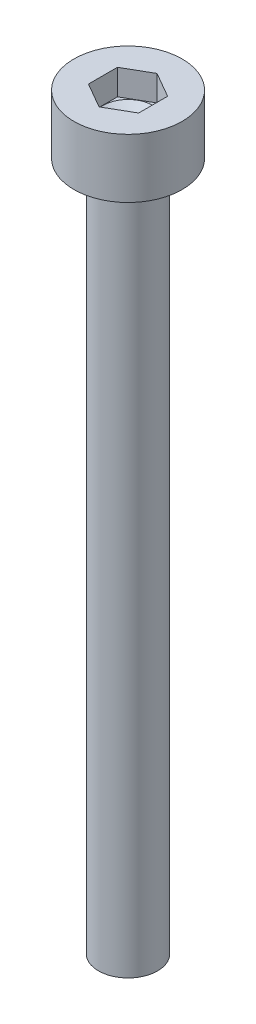
ISO-10303-21;
HEADER;
FILE_DESCRIPTION(('STEP AP214'),'2;1');
FILE_NAME('part.step','',(''),(''),'','','');
FILE_SCHEMA(('AUTOMOTIVE_DESIGN { 1 0 10303 214 1 1 1 1 }'));
ENDSEC;
DATA;
#1=APPLICATION_CONTEXT('core data for automotive mechanical design processes');
#2=APPLICATION_PROTOCOL_DEFINITION('international standard','automotive_design',2000,#1);
#3=PRODUCT_CONTEXT('',#1,'mechanical');
#4=PRODUCT('Part','Part','',(#3));
#5=PRODUCT_RELATED_PRODUCT_CATEGORY('part','',(#4));
#6=PRODUCT_DEFINITION_FORMATION('','',#4);
#7=PRODUCT_DEFINITION_CONTEXT('part definition',#1,'design');
#8=PRODUCT_DEFINITION('design','',#6,#7);
#9=PRODUCT_DEFINITION_SHAPE('','',#8);
#10=(LENGTH_UNIT() NAMED_UNIT(*) SI_UNIT(.MILLI.,.METRE.));
#11=(NAMED_UNIT(*) PLANE_ANGLE_UNIT() SI_UNIT($,.RADIAN.));
#12=(NAMED_UNIT(*) SI_UNIT($,.STERADIAN.) SOLID_ANGLE_UNIT());
#13=UNCERTAINTY_MEASURE_WITH_UNIT(LENGTH_MEASURE(1.E-05),#10,'distance_accuracy_value','');
#14=(GEOMETRIC_REPRESENTATION_CONTEXT(3) GLOBAL_UNCERTAINTY_ASSIGNED_CONTEXT((#13)) GLOBAL_UNIT_ASSIGNED_CONTEXT((#10,
#11,#12)) REPRESENTATION_CONTEXT('',''));
#15=CARTESIAN_POINT('',(0.,0.,0.));
#16=DIRECTION('',(0.,0.,1.));
#17=DIRECTION('',(1.,0.,0.));
#18=AXIS2_PLACEMENT_3D('',#15,#16,#17);
#19=CARTESIAN_POINT('',(0.,0.,0.));
#20=DIRECTION('',(0.,-1.,0.));
#21=DIRECTION('',(0.,0.,-1.));
#22=AXIS2_PLACEMENT_3D('',#19,#20,#21);
#23=PLANE('',#22);
#24=CARTESIAN_POINT('',(0.,0.,0.));
#25=DIRECTION('',(0.,-1.,0.));
#26=DIRECTION('',(0.,0.,-1.));
#27=AXIS2_PLACEMENT_3D('',#24,#25,#26);
#28=CIRCLE('',#27,2.75);
#29=CARTESIAN_POINT('',(0.,0.,-2.75));
#30=VERTEX_POINT('',#29);
#31=EDGE_CURVE('E11',#30,#30,#28,.T.);
#32=ORIENTED_EDGE('',*,*,#31,.T.);
#33=EDGE_LOOP('',(#32));
#34=FACE_BOUND('',#33,.T.);
#35=CARTESIAN_POINT('',(0.,0.,0.));
#36=DIRECTION('',(0.,-1.,0.));
#37=DIRECTION('',(0.,0.,-1.));
#38=AXIS2_PLACEMENT_3D('',#35,#36,#37);
#39=CIRCLE('',#38,1.5);
#40=CARTESIAN_POINT('',(0.,0.,-1.5));
#41=VERTEX_POINT('',#40);
#42=EDGE_CURVE('E143',#41,#41,#39,.T.);
#43=ORIENTED_EDGE('',*,*,#42,.F.);
#44=EDGE_LOOP('',(#43));
#45=FACE_BOUND('',#44,.T.);
#46=ADVANCED_FACE('F17',(#34,#45),#23,.T.);
#47=CARTESIAN_POINT('',(0.,0.,0.));
#48=DIRECTION('',(0.,-1.,0.));
#49=DIRECTION('',(0.,0.,-1.));
#50=AXIS2_PLACEMENT_3D('',#47,#48,#49);
#51=CYLINDRICAL_SURFACE('',#50,2.75);
#52=CARTESIAN_POINT('',(0.,3.,0.));
#53=DIRECTION('',(0.,-1.,0.));
#54=DIRECTION('',(0.,0.,-1.));
#55=AXIS2_PLACEMENT_3D('',#52,#53,#54);
#56=CIRCLE('',#55,2.75);
#57=CARTESIAN_POINT('',(0.,3.,-2.75));
#58=VERTEX_POINT('',#57);
#59=EDGE_CURVE('E24',#58,#58,#56,.T.);
#60=ORIENTED_EDGE('',*,*,#59,.T.);
#61=EDGE_LOOP('',(#60));
#62=FACE_BOUND('',#61,.T.);
#63=ORIENTED_EDGE('',*,*,#31,.F.);
#64=EDGE_LOOP('',(#63));
#65=FACE_BOUND('',#64,.T.);
#66=ADVANCED_FACE('F120',(#62,#65),#51,.T.);
#67=CARTESIAN_POINT('',(2.75,3.,0.));
#68=DIRECTION('',(0.,1.,0.));
#69=DIRECTION('',(0.,0.,1.));
#70=AXIS2_PLACEMENT_3D('',#67,#68,#69);
#71=PLANE('',#70);
#72=DIRECTION('',(-0.866025403784439,0.,-0.5));
#73=VECTOR('',#72,1.);
#74=CARTESIAN_POINT('',(1.275,3.,-0.736121593216773));
#75=LINE('',#74,#73);
#76=CARTESIAN_POINT('',(1.275,3.,-0.736121593216773));
#77=VERTEX_POINT('',#76);
#78=CARTESIAN_POINT('',(0.,3.,-1.47224318643355));
#79=VERTEX_POINT('',#78);
#80=EDGE_CURVE('E31',#77,#79,#75,.T.);
#81=ORIENTED_EDGE('',*,*,#80,.F.);
#82=DIRECTION('',(0.,0.,-1.));
#83=VECTOR('',#82,1.);
#84=CARTESIAN_POINT('',(1.275,3.,0.736121593216772));
#85=LINE('',#84,#83);
#86=CARTESIAN_POINT('',(1.275,3.,0.736121593216772));
#87=VERTEX_POINT('',#86);
#88=EDGE_CURVE('E101',#87,#77,#85,.T.);
#89=ORIENTED_EDGE('',*,*,#88,.F.);
#90=DIRECTION('',(0.866025403784439,0.,-0.5));
#91=VECTOR('',#90,1.);
#92=CARTESIAN_POINT('',(0.,3.,1.47224318643355));
#93=LINE('',#92,#91);
#94=CARTESIAN_POINT('',(0.,3.,1.47224318643355));
#95=VERTEX_POINT('',#94);
#96=EDGE_CURVE('E95',#95,#87,#93,.T.);
#97=ORIENTED_EDGE('',*,*,#96,.F.);
#98=DIRECTION('',(0.866025403784439,0.,0.5));
#99=VECTOR('',#98,1.);
#100=CARTESIAN_POINT('',(-1.275,3.,0.736121593216773));
#101=LINE('',#100,#99);
#102=CARTESIAN_POINT('',(-1.275,3.,0.736121593216773));
#103=VERTEX_POINT('',#102);
#104=EDGE_CURVE('E93',#103,#95,#101,.T.);
#105=ORIENTED_EDGE('',*,*,#104,.F.);
#106=DIRECTION('',(0.,0.,1.));
#107=VECTOR('',#106,1.);
#108=CARTESIAN_POINT('',(-1.275,3.,-0.736121593216773));
#109=LINE('',#108,#107);
#110=CARTESIAN_POINT('',(-1.275,3.,-0.736121593216773));
#111=VERTEX_POINT('',#110);
#112=EDGE_CURVE('E75',#111,#103,#109,.T.);
#113=ORIENTED_EDGE('',*,*,#112,.F.);
#114=DIRECTION('',(-0.866025403784439,0.,0.5));
#115=VECTOR('',#114,1.);
#116=CARTESIAN_POINT('',(0.,3.,-1.47224318643354));
#117=LINE('',#116,#115);
#118=EDGE_CURVE('E85',#79,#111,#117,.T.);
#119=ORIENTED_EDGE('',*,*,#118,.F.);
#120=EDGE_LOOP('',(#81,#89,#97,#105,#113,#119));
#121=FACE_BOUND('',#120,.T.);
#122=ORIENTED_EDGE('',*,*,#59,.F.);
#123=EDGE_LOOP('',(#122));
#124=FACE_BOUND('',#123,.T.);
#125=ADVANCED_FACE('F89',(#121,#124),#71,.T.);
#126=CARTESIAN_POINT('',(1.275,-2.19518934071246,-0.736121593216773));
#127=DIRECTION('',(0.5,0.,-0.866025403784439));
#128=DIRECTION('',(-0.866025403784439,0.,-0.5));
#129=AXIS2_PLACEMENT_3D('',#126,#127,#128);
#130=PLANE('',#129);
#131=DIRECTION('',(0.866025403784439,0.,0.5));
#132=VECTOR('',#131,1.);
#133=CARTESIAN_POINT('',(1.275,1.7,-0.736121593216773));
#134=LINE('',#133,#132);
#135=CARTESIAN_POINT('',(0.,1.7,-1.47224318643354));
#136=VERTEX_POINT('',#135);
#137=CARTESIAN_POINT('',(1.275,1.7,-0.736121593216773));
#138=VERTEX_POINT('',#137);
#139=EDGE_CURVE('E115',#136,#138,#134,.T.);
#140=ORIENTED_EDGE('',*,*,#139,.T.);
#141=DIRECTION('',(0.,1.,0.));
#142=VECTOR('',#141,1.);
#143=CARTESIAN_POINT('',(1.275,-2.19518934071246,-0.736121593216773));
#144=LINE('',#143,#142);
#145=EDGE_CURVE('E104',#138,#77,#144,.T.);
#146=ORIENTED_EDGE('',*,*,#145,.T.);
#147=ORIENTED_EDGE('',*,*,#80,.T.);
#148=DIRECTION('',(0.,1.,0.));
#149=VECTOR('',#148,1.);
#150=CARTESIAN_POINT('',(0.,-2.19518934071246,-1.47224318643354));
#151=LINE('',#150,#149);
#152=EDGE_CURVE('E82',#136,#79,#151,.T.);
#153=ORIENTED_EDGE('',*,*,#152,.F.);
#154=EDGE_LOOP('',(#140,#146,#147,#153));
#155=FACE_BOUND('',#154,.T.);
#156=ADVANCED_FACE('F123',(#155),#130,.F.);
#157=CARTESIAN_POINT('',(1.275,-2.19518934071246,0.736121593216772));
#158=DIRECTION('',(1.,0.,0.));
#159=DIRECTION('',(0.,0.,-1.));
#160=AXIS2_PLACEMENT_3D('',#157,#158,#159);
#161=PLANE('',#160);
#162=DIRECTION('',(0.,0.,1.));
#163=VECTOR('',#162,1.);
#164=CARTESIAN_POINT('',(1.275,1.7,0.736121593216772));
#165=LINE('',#164,#163);
#166=CARTESIAN_POINT('',(1.275,1.7,0.736121593216772));
#167=VERTEX_POINT('',#166);
#168=EDGE_CURVE('E155',#138,#167,#165,.T.);
#169=ORIENTED_EDGE('',*,*,#168,.T.);
#170=DIRECTION('',(0.,1.,0.));
#171=VECTOR('',#170,1.);
#172=CARTESIAN_POINT('',(1.275,-2.19518934071246,0.736121593216772));
#173=LINE('',#172,#171);
#174=EDGE_CURVE('E106',#167,#87,#173,.T.);
#175=ORIENTED_EDGE('',*,*,#174,.T.);
#176=ORIENTED_EDGE('',*,*,#88,.T.);
#177=ORIENTED_EDGE('',*,*,#145,.F.);
#178=EDGE_LOOP('',(#169,#175,#176,#177));
#179=FACE_BOUND('',#178,.T.);
#180=ADVANCED_FACE('F131',(#179),#161,.F.);
#181=CARTESIAN_POINT('',(0.,-2.19518934071246,1.47224318643355));
#182=DIRECTION('',(0.5,0.,0.866025403784438));
#183=DIRECTION('',(0.866025403784439,0.,-0.5));
#184=AXIS2_PLACEMENT_3D('',#181,#182,#183);
#185=PLANE('',#184);
#186=DIRECTION('',(-0.866025403784439,0.,0.5));
#187=VECTOR('',#186,1.);
#188=CARTESIAN_POINT('',(0.,1.7,1.47224318643355));
#189=LINE('',#188,#187);
#190=CARTESIAN_POINT('',(0.,1.7,1.47224318643355));
#191=VERTEX_POINT('',#190);
#192=EDGE_CURVE('E153',#167,#191,#189,.T.);
#193=ORIENTED_EDGE('',*,*,#192,.T.);
#194=DIRECTION('',(0.,1.,0.));
#195=VECTOR('',#194,1.);
#196=CARTESIAN_POINT('',(0.,-2.19518934071246,1.47224318643355));
#197=LINE('',#196,#195);
#198=EDGE_CURVE('E108',#191,#95,#197,.T.);
#199=ORIENTED_EDGE('',*,*,#198,.T.);
#200=ORIENTED_EDGE('',*,*,#96,.T.);
#201=ORIENTED_EDGE('',*,*,#174,.F.);
#202=EDGE_LOOP('',(#193,#199,#200,#201));
#203=FACE_BOUND('',#202,.T.);
#204=ADVANCED_FACE('F168',(#203),#185,.F.);
#205=CARTESIAN_POINT('',(-1.275,-2.19518934071246,0.736121593216773));
#206=DIRECTION('',(-0.5,0.,0.866025403784439));
#207=DIRECTION('',(0.866025403784439,0.,0.5));
#208=AXIS2_PLACEMENT_3D('',#205,#206,#207);
#209=PLANE('',#208);
#210=DIRECTION('',(-0.866025403784439,0.,-0.5));
#211=VECTOR('',#210,1.);
#212=CARTESIAN_POINT('',(-1.275,1.7,0.736121593216773));
#213=LINE('',#212,#211);
#214=CARTESIAN_POINT('',(-1.275,1.7,0.736121593216773));
#215=VERTEX_POINT('',#214);
#216=EDGE_CURVE('E151',#191,#215,#213,.T.);
#217=ORIENTED_EDGE('',*,*,#216,.T.);
#218=DIRECTION('',(0.,1.,0.));
#219=VECTOR('',#218,1.);
#220=CARTESIAN_POINT('',(-1.275,-2.19518934071246,0.736121593216773));
#221=LINE('',#220,#219);
#222=EDGE_CURVE('E81',#215,#103,#221,.T.);
#223=ORIENTED_EDGE('',*,*,#222,.T.);
#224=ORIENTED_EDGE('',*,*,#104,.T.);
#225=ORIENTED_EDGE('',*,*,#198,.F.);
#226=EDGE_LOOP('',(#217,#223,#224,#225));
#227=FACE_BOUND('',#226,.T.);
#228=ADVANCED_FACE('F171',(#227),#209,.F.);
#229=CARTESIAN_POINT('',(-1.275,-2.19518934071246,-0.736121593216773));
#230=DIRECTION('',(-1.,0.,0.));
#231=DIRECTION('',(0.,0.,1.));
#232=AXIS2_PLACEMENT_3D('',#229,#230,#231);
#233=PLANE('',#232);
#234=DIRECTION('',(0.,0.,-1.));
#235=VECTOR('',#234,1.);
#236=CARTESIAN_POINT('',(-1.275,1.7,-0.736121593216773));
#237=LINE('',#236,#235);
#238=CARTESIAN_POINT('',(-1.275,1.7,-0.736121593216773));
#239=VERTEX_POINT('',#238);
#240=EDGE_CURVE('E78',#215,#239,#237,.T.);
#241=ORIENTED_EDGE('',*,*,#240,.T.);
#242=DIRECTION('',(0.,1.,0.));
#243=VECTOR('',#242,1.);
#244=CARTESIAN_POINT('',(-1.275,-2.19518934071246,-0.736121593216773));
#245=LINE('',#244,#243);
#246=EDGE_CURVE('E70',#239,#111,#245,.T.);
#247=ORIENTED_EDGE('',*,*,#246,.T.);
#248=ORIENTED_EDGE('',*,*,#112,.T.);
#249=ORIENTED_EDGE('',*,*,#222,.F.);
#250=EDGE_LOOP('',(#241,#247,#248,#249));
#251=FACE_BOUND('',#250,.T.);
#252=ADVANCED_FACE('F72',(#251),#233,.F.);
#253=CARTESIAN_POINT('',(0.,-2.19518934071246,-1.47224318643354));
#254=DIRECTION('',(-0.5,0.,-0.866025403784439));
#255=DIRECTION('',(-0.866025403784439,0.,0.5));
#256=AXIS2_PLACEMENT_3D('',#253,#254,#255);
#257=PLANE('',#256);
#258=DIRECTION('',(0.866025403784439,0.,-0.5));
#259=VECTOR('',#258,1.);
#260=CARTESIAN_POINT('',(0.,1.7,-1.47224318643354));
#261=LINE('',#260,#259);
#262=EDGE_CURVE('E112',#239,#136,#261,.T.);
#263=ORIENTED_EDGE('',*,*,#262,.T.);
#264=ORIENTED_EDGE('',*,*,#152,.T.);
#265=ORIENTED_EDGE('',*,*,#118,.T.);
#266=ORIENTED_EDGE('',*,*,#246,.F.);
#267=EDGE_LOOP('',(#263,#264,#265,#266));
#268=FACE_BOUND('',#267,.T.);
#269=ADVANCED_FACE('F86',(#268),#257,.F.);
#270=CARTESIAN_POINT('',(0.,1.7,0.));
#271=DIRECTION('',(0.,1.,0.));
#272=DIRECTION('',(0.,0.,1.));
#273=AXIS2_PLACEMENT_3D('',#270,#271,#272);
#274=PLANE('',#273);
#275=CARTESIAN_POINT('',(0.,1.7,0.));
#276=DIRECTION('',(0.,1.,0.));
#277=DIRECTION('',(0.,0.,1.));
#278=AXIS2_PLACEMENT_3D('',#275,#276,#277);
#279=CIRCLE('',#278,1.26);
#280=CARTESIAN_POINT('',(0.,1.7,1.26));
#281=VERTEX_POINT('',#280);
#282=EDGE_CURVE('E114',#281,#281,#279,.T.);
#283=ORIENTED_EDGE('',*,*,#282,.F.);
#284=EDGE_LOOP('',(#283));
#285=FACE_BOUND('',#284,.T.);
#286=ORIENTED_EDGE('',*,*,#139,.F.);
#287=ORIENTED_EDGE('',*,*,#262,.F.);
#288=ORIENTED_EDGE('',*,*,#240,.F.);
#289=ORIENTED_EDGE('',*,*,#216,.F.);
#290=ORIENTED_EDGE('',*,*,#192,.F.);
#291=ORIENTED_EDGE('',*,*,#168,.F.);
#292=EDGE_LOOP('',(#286,#287,#288,#289,#290,#291));
#293=FACE_BOUND('',#292,.T.);
#294=ADVANCED_FACE('F162',(#285,#293),#274,.T.);
#295=CARTESIAN_POINT('',(0.,1.7,0.));
#296=DIRECTION('',(0.,1.,0.));
#297=DIRECTION('',(0.,0.,1.));
#298=AXIS2_PLACEMENT_3D('',#295,#296,#297);
#299=CONICAL_SURFACE('',#298,1.26,1.0471975511966);
#300=CARTESIAN_POINT('',(0.,0.972538660821063,0.));
#301=VERTEX_POINT('',#300);
#302=VERTEX_LOOP('',#301);
#303=FACE_BOUND('',#302,.T.);
#304=ORIENTED_EDGE('',*,*,#282,.T.);
#305=EDGE_LOOP('',(#304));
#306=FACE_BOUND('',#305,.T.);
#307=ADVANCED_FACE('F184',(#303,#306),#299,.F.);
#308=CARTESIAN_POINT('',(0.,-35.,0.));
#309=DIRECTION('',(0.,1.,0.));
#310=DIRECTION('',(0.,0.,1.));
#311=AXIS2_PLACEMENT_3D('',#308,#309,#310);
#312=CYLINDRICAL_SURFACE('',#311,1.5);
#313=CARTESIAN_POINT('',(0.,-35.,0.));
#314=DIRECTION('',(0.,-1.,0.));
#315=DIRECTION('',(0.,0.,-1.));
#316=AXIS2_PLACEMENT_3D('',#313,#314,#315);
#317=CIRCLE('',#316,1.5);
#318=CARTESIAN_POINT('',(0.,-35.,-1.5));
#319=VERTEX_POINT('',#318);
#320=EDGE_CURVE('E145',#319,#319,#317,.T.);
#321=ORIENTED_EDGE('',*,*,#320,.F.);
#322=EDGE_LOOP('',(#321));
#323=FACE_BOUND('',#322,.T.);
#324=ORIENTED_EDGE('',*,*,#42,.T.);
#325=EDGE_LOOP('',(#324));
#326=FACE_BOUND('',#325,.T.);
#327=ADVANCED_FACE('F186',(#323,#326),#312,.T.);
#328=CARTESIAN_POINT('',(0.,-35.,0.));
#329=DIRECTION('',(0.,-1.,0.));
#330=DIRECTION('',(0.,0.,-1.));
#331=AXIS2_PLACEMENT_3D('',#328,#329,#330);
#332=PLANE('',#331);
#333=ORIENTED_EDGE('',*,*,#320,.T.);
#334=EDGE_LOOP('',(#333));
#335=FACE_BOUND('',#334,.T.);
#336=ADVANCED_FACE('F192',(#335),#332,.T.);
#337=CLOSED_SHELL('',(#46,#66,#125,#156,#180,#204,#228,#252,#269,#294,#307,#327,#336));
#338=MANIFOLD_SOLID_BREP('B1',#337);
#339=ADVANCED_BREP_SHAPE_REPRESENTATION('',(#18,#338),#14);
#340=SHAPE_DEFINITION_REPRESENTATION(#9,#339);
ENDSEC;
END-ISO-10303-21;
